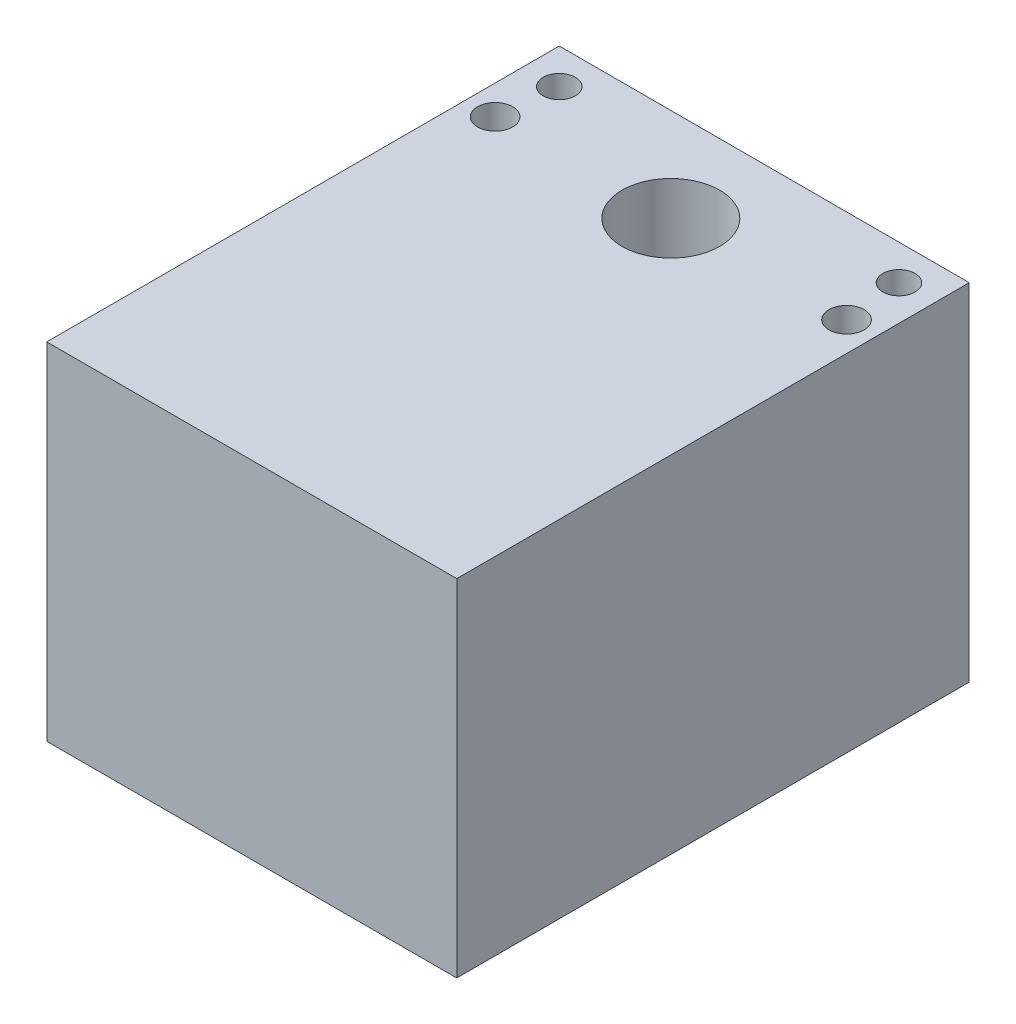
ISO-10303-21;
HEADER;
FILE_DESCRIPTION(('STEP AP214'),'2;1');
FILE_NAME('part.step','',(''),(''),'','','');
FILE_SCHEMA(('AUTOMOTIVE_DESIGN { 1 0 10303 214 1 1 1 1 }'));
ENDSEC;
DATA;
#1=APPLICATION_CONTEXT('core data for automotive mechanical design processes');
#2=APPLICATION_PROTOCOL_DEFINITION('international standard','automotive_design',2000,#1);
#3=PRODUCT_CONTEXT('',#1,'mechanical');
#4=PRODUCT('Part','Part','',(#3));
#5=PRODUCT_RELATED_PRODUCT_CATEGORY('part','',(#4));
#6=PRODUCT_DEFINITION_FORMATION('','',#4);
#7=PRODUCT_DEFINITION_CONTEXT('part definition',#1,'design');
#8=PRODUCT_DEFINITION('design','',#6,#7);
#9=PRODUCT_DEFINITION_SHAPE('','',#8);
#10=(LENGTH_UNIT() NAMED_UNIT(*) SI_UNIT(.MILLI.,.METRE.));
#11=(NAMED_UNIT(*) PLANE_ANGLE_UNIT() SI_UNIT($,.RADIAN.));
#12=(NAMED_UNIT(*) SI_UNIT($,.STERADIAN.) SOLID_ANGLE_UNIT());
#13=UNCERTAINTY_MEASURE_WITH_UNIT(LENGTH_MEASURE(1.E-05),#10,'distance_accuracy_value','');
#14=(GEOMETRIC_REPRESENTATION_CONTEXT(3) GLOBAL_UNCERTAINTY_ASSIGNED_CONTEXT((#13)) GLOBAL_UNIT_ASSIGNED_CONTEXT((#10,
#11,#12)) REPRESENTATION_CONTEXT('',''));
#15=CARTESIAN_POINT('',(0.,0.,0.));
#16=DIRECTION('',(0.,0.,1.));
#17=DIRECTION('',(1.,0.,0.));
#18=AXIS2_PLACEMENT_3D('',#15,#16,#17);
#19=CARTESIAN_POINT('',(0.,30.,0.));
#20=DIRECTION('',(0.,1.,0.));
#21=DIRECTION('',(0.,0.,1.));
#22=AXIS2_PLACEMENT_3D('',#19,#20,#21);
#23=PLANE('',#22);
#24=CARTESIAN_POINT('',(15.24,30.,-14.122));
#25=DIRECTION('',(0.,1.,0.));
#26=DIRECTION('',(0.,0.,1.));
#27=AXIS2_PLACEMENT_3D('',#24,#25,#26);
#28=CIRCLE('',#27,1.52400000000001);
#29=CARTESIAN_POINT('',(15.24,30.,-12.598));
#30=VERTEX_POINT('',#29);
#31=EDGE_CURVE('E129',#30,#30,#28,.T.);
#32=ORIENTED_EDGE('',*,*,#31,.F.);
#33=EDGE_LOOP('',(#32));
#34=FACE_BOUND('',#33,.T.);
#35=CARTESIAN_POINT('',(14.732,30.,-19.177));
#36=DIRECTION('',(0.,1.,0.));
#37=DIRECTION('',(0.,0.,1.));
#38=AXIS2_PLACEMENT_3D('',#35,#36,#37);
#39=CIRCLE('',#38,1.397);
#40=CARTESIAN_POINT('',(14.732,30.,-17.78));
#41=VERTEX_POINT('',#40);
#42=EDGE_CURVE('E117',#41,#41,#39,.T.);
#43=ORIENTED_EDGE('',*,*,#42,.F.);
#44=EDGE_LOOP('',(#43));
#45=FACE_BOUND('',#44,.T.);
#46=DIRECTION('',(0.,0.,-1.));
#47=VECTOR('',#46,1.);
#48=CARTESIAN_POINT('',(17.78,30.,-22.225));
#49=LINE('',#48,#47);
#50=CARTESIAN_POINT('',(17.78,30.,22.225));
#51=VERTEX_POINT('',#50);
#52=CARTESIAN_POINT('',(17.78,30.,-22.225));
#53=VERTEX_POINT('',#52);
#54=EDGE_CURVE('E87',#51,#53,#49,.T.);
#55=ORIENTED_EDGE('',*,*,#54,.T.);
#56=DIRECTION('',(-1.,0.,0.));
#57=VECTOR('',#56,1.);
#58=CARTESIAN_POINT('',(-17.78,30.,-22.225));
#59=LINE('',#58,#57);
#60=CARTESIAN_POINT('',(-17.78,30.,-22.225));
#61=VERTEX_POINT('',#60);
#62=EDGE_CURVE('E82',#53,#61,#59,.T.);
#63=ORIENTED_EDGE('',*,*,#62,.T.);
#64=DIRECTION('',(0.,0.,1.));
#65=VECTOR('',#64,1.);
#66=CARTESIAN_POINT('',(-17.78,30.,-22.225));
#67=LINE('',#66,#65);
#68=CARTESIAN_POINT('',(-17.78,30.,22.225));
#69=VERTEX_POINT('',#68);
#70=EDGE_CURVE('E85',#61,#69,#67,.T.);
#71=ORIENTED_EDGE('',*,*,#70,.T.);
#72=DIRECTION('',(1.,0.,0.));
#73=VECTOR('',#72,1.);
#74=CARTESIAN_POINT('',(-17.78,30.,22.225));
#75=LINE('',#74,#73);
#76=EDGE_CURVE('E52',#69,#51,#75,.T.);
#77=ORIENTED_EDGE('',*,*,#76,.T.);
#78=EDGE_LOOP('',(#55,#63,#71,#77));
#79=FACE_BOUND('',#78,.T.);
#80=CARTESIAN_POINT('',(-14.732,30.,-19.177));
#81=DIRECTION('',(0.,1.,0.));
#82=DIRECTION('',(0.,0.,1.));
#83=AXIS2_PLACEMENT_3D('',#80,#81,#82);
#84=CIRCLE('',#83,1.397);
#85=CARTESIAN_POINT('',(-14.732,30.,-17.78));
#86=VERTEX_POINT('',#85);
#87=EDGE_CURVE('E102',#86,#86,#84,.T.);
#88=ORIENTED_EDGE('',*,*,#87,.F.);
#89=EDGE_LOOP('',(#88));
#90=FACE_BOUND('',#89,.T.);
#91=CARTESIAN_POINT('',(-15.24,30.,-14.122));
#92=DIRECTION('',(0.,1.,0.));
#93=DIRECTION('',(0.,0.,1.));
#94=AXIS2_PLACEMENT_3D('',#91,#92,#93);
#95=CIRCLE('',#94,1.524);
#96=CARTESIAN_POINT('',(-15.24,30.,-12.598));
#97=VERTEX_POINT('',#96);
#98=EDGE_CURVE('E123',#97,#97,#95,.T.);
#99=ORIENTED_EDGE('',*,*,#98,.F.);
#100=EDGE_LOOP('',(#99));
#101=FACE_BOUND('',#100,.T.);
#102=CARTESIAN_POINT('',(0.,30.,-14.122));
#103=DIRECTION('',(0.,1.,0.));
#104=DIRECTION('',(0.,0.,1.));
#105=AXIS2_PLACEMENT_3D('',#102,#103,#104);
#106=CIRCLE('',#105,4.23333333333333);
#107=CARTESIAN_POINT('',(0.,30.,-9.88866666666666));
#108=VERTEX_POINT('',#107);
#109=EDGE_CURVE('E135',#108,#108,#106,.T.);
#110=ORIENTED_EDGE('',*,*,#109,.F.);
#111=EDGE_LOOP('',(#110));
#112=FACE_BOUND('',#111,.T.);
#113=ADVANCED_FACE('F35',(#34,#45,#79,#90,#101,#112),#23,.T.);
#114=CARTESIAN_POINT('',(0.,0.,0.));
#115=DIRECTION('',(0.,1.,0.));
#116=DIRECTION('',(0.,0.,1.));
#117=AXIS2_PLACEMENT_3D('',#114,#115,#116);
#118=PLANE('',#117);
#119=DIRECTION('',(0.,0.,-1.));
#120=VECTOR('',#119,1.);
#121=CARTESIAN_POINT('',(17.78,0.,-22.225));
#122=LINE('',#121,#120);
#123=CARTESIAN_POINT('',(17.78,0.,22.225));
#124=VERTEX_POINT('',#123);
#125=CARTESIAN_POINT('',(17.78,0.,-22.225));
#126=VERTEX_POINT('',#125);
#127=EDGE_CURVE('E99',#124,#126,#122,.T.);
#128=ORIENTED_EDGE('',*,*,#127,.F.);
#129=DIRECTION('',(1.,0.,0.));
#130=VECTOR('',#129,1.);
#131=CARTESIAN_POINT('',(-17.78,0.,22.225));
#132=LINE('',#131,#130);
#133=CARTESIAN_POINT('',(-17.78,0.,22.225));
#134=VERTEX_POINT('',#133);
#135=EDGE_CURVE('E75',#134,#124,#132,.T.);
#136=ORIENTED_EDGE('',*,*,#135,.F.);
#137=DIRECTION('',(0.,0.,1.));
#138=VECTOR('',#137,1.);
#139=CARTESIAN_POINT('',(-17.78,0.,-22.225));
#140=LINE('',#139,#138);
#141=CARTESIAN_POINT('',(-17.78,0.,-22.225));
#142=VERTEX_POINT('',#141);
#143=EDGE_CURVE('E69',#142,#134,#140,.T.);
#144=ORIENTED_EDGE('',*,*,#143,.F.);
#145=DIRECTION('',(-1.,0.,0.));
#146=VECTOR('',#145,1.);
#147=CARTESIAN_POINT('',(-17.78,0.,-22.225));
#148=LINE('',#147,#146);
#149=EDGE_CURVE('E91',#126,#142,#148,.T.);
#150=ORIENTED_EDGE('',*,*,#149,.F.);
#151=EDGE_LOOP('',(#128,#136,#144,#150));
#152=FACE_BOUND('',#151,.T.);
#153=CARTESIAN_POINT('',(-14.732,0.,-19.177));
#154=DIRECTION('',(0.,1.,0.));
#155=DIRECTION('',(0.,0.,1.));
#156=AXIS2_PLACEMENT_3D('',#153,#154,#155);
#157=CIRCLE('',#156,1.397);
#158=CARTESIAN_POINT('',(-14.732,0.,-17.78));
#159=VERTEX_POINT('',#158);
#160=EDGE_CURVE('E114',#159,#159,#157,.T.);
#161=ORIENTED_EDGE('',*,*,#160,.T.);
#162=EDGE_LOOP('',(#161));
#163=FACE_BOUND('',#162,.T.);
#164=CARTESIAN_POINT('',(14.732,0.,-19.177));
#165=DIRECTION('',(0.,1.,0.));
#166=DIRECTION('',(0.,0.,1.));
#167=AXIS2_PLACEMENT_3D('',#164,#165,#166);
#168=CIRCLE('',#167,1.397);
#169=CARTESIAN_POINT('',(14.732,0.,-17.78));
#170=VERTEX_POINT('',#169);
#171=EDGE_CURVE('E120',#170,#170,#168,.T.);
#172=ORIENTED_EDGE('',*,*,#171,.T.);
#173=EDGE_LOOP('',(#172));
#174=FACE_BOUND('',#173,.T.);
#175=CARTESIAN_POINT('',(-15.24,0.,-14.122));
#176=DIRECTION('',(0.,1.,0.));
#177=DIRECTION('',(0.,0.,1.));
#178=AXIS2_PLACEMENT_3D('',#175,#176,#177);
#179=CIRCLE('',#178,1.524);
#180=CARTESIAN_POINT('',(-15.24,0.,-12.598));
#181=VERTEX_POINT('',#180);
#182=EDGE_CURVE('E126',#181,#181,#179,.T.);
#183=ORIENTED_EDGE('',*,*,#182,.T.);
#184=EDGE_LOOP('',(#183));
#185=FACE_BOUND('',#184,.T.);
#186=CARTESIAN_POINT('',(15.24,0.,-14.122));
#187=DIRECTION('',(0.,1.,0.));
#188=DIRECTION('',(0.,0.,1.));
#189=AXIS2_PLACEMENT_3D('',#186,#187,#188);
#190=CIRCLE('',#189,1.52400000000001);
#191=CARTESIAN_POINT('',(15.24,0.,-12.598));
#192=VERTEX_POINT('',#191);
#193=EDGE_CURVE('E132',#192,#192,#190,.T.);
#194=ORIENTED_EDGE('',*,*,#193,.T.);
#195=EDGE_LOOP('',(#194));
#196=FACE_BOUND('',#195,.T.);
#197=CARTESIAN_POINT('',(0.,0.,-14.122));
#198=DIRECTION('',(0.,1.,0.));
#199=DIRECTION('',(0.,0.,1.));
#200=AXIS2_PLACEMENT_3D('',#197,#198,#199);
#201=CIRCLE('',#200,4.23333333333333);
#202=CARTESIAN_POINT('',(0.,0.,-9.88866666666666));
#203=VERTEX_POINT('',#202);
#204=EDGE_CURVE('E138',#203,#203,#201,.T.);
#205=ORIENTED_EDGE('',*,*,#204,.T.);
#206=EDGE_LOOP('',(#205));
#207=FACE_BOUND('',#206,.T.);
#208=ADVANCED_FACE('F110',(#152,#163,#174,#185,#196,#207),#118,.F.);
#209=CARTESIAN_POINT('',(17.78,30.,-22.225));
#210=DIRECTION('',(-1.,0.,0.));
#211=DIRECTION('',(0.,0.,1.));
#212=AXIS2_PLACEMENT_3D('',#209,#210,#211);
#213=PLANE('',#212);
#214=ORIENTED_EDGE('',*,*,#127,.T.);
#215=DIRECTION('',(0.,-1.,0.));
#216=VECTOR('',#215,1.);
#217=CARTESIAN_POINT('',(17.78,30.,-22.225));
#218=LINE('',#217,#216);
#219=EDGE_CURVE('E11',#53,#126,#218,.T.);
#220=ORIENTED_EDGE('',*,*,#219,.F.);
#221=ORIENTED_EDGE('',*,*,#54,.F.);
#222=DIRECTION('',(0.,-1.,0.));
#223=VECTOR('',#222,1.);
#224=CARTESIAN_POINT('',(17.78,30.,22.225));
#225=LINE('',#224,#223);
#226=EDGE_CURVE('E95',#51,#124,#225,.T.);
#227=ORIENTED_EDGE('',*,*,#226,.T.);
#228=EDGE_LOOP('',(#214,#220,#221,#227));
#229=FACE_BOUND('',#228,.T.);
#230=ADVANCED_FACE('F37',(#229),#213,.F.);
#231=CARTESIAN_POINT('',(-17.78,30.,-22.225));
#232=DIRECTION('',(0.,0.,1.));
#233=DIRECTION('',(1.,0.,0.));
#234=AXIS2_PLACEMENT_3D('',#231,#232,#233);
#235=PLANE('',#234);
#236=ORIENTED_EDGE('',*,*,#149,.T.);
#237=DIRECTION('',(0.,-1.,0.));
#238=VECTOR('',#237,1.);
#239=CARTESIAN_POINT('',(-17.78,30.,-22.225));
#240=LINE('',#239,#238);
#241=EDGE_CURVE('E44',#61,#142,#240,.T.);
#242=ORIENTED_EDGE('',*,*,#241,.F.);
#243=ORIENTED_EDGE('',*,*,#62,.F.);
#244=ORIENTED_EDGE('',*,*,#219,.T.);
#245=EDGE_LOOP('',(#236,#242,#243,#244));
#246=FACE_BOUND('',#245,.T.);
#247=ADVANCED_FACE('F90',(#246),#235,.F.);
#248=CARTESIAN_POINT('',(-17.78,30.,-22.225));
#249=DIRECTION('',(1.,0.,0.));
#250=DIRECTION('',(0.,0.,-1.));
#251=AXIS2_PLACEMENT_3D('',#248,#249,#250);
#252=PLANE('',#251);
#253=ORIENTED_EDGE('',*,*,#143,.T.);
#254=DIRECTION('',(0.,-1.,0.));
#255=VECTOR('',#254,1.);
#256=CARTESIAN_POINT('',(-17.78,30.,22.225));
#257=LINE('',#256,#255);
#258=EDGE_CURVE('E92',#69,#134,#257,.T.);
#259=ORIENTED_EDGE('',*,*,#258,.F.);
#260=ORIENTED_EDGE('',*,*,#70,.F.);
#261=ORIENTED_EDGE('',*,*,#241,.T.);
#262=EDGE_LOOP('',(#253,#259,#260,#261));
#263=FACE_BOUND('',#262,.T.);
#264=ADVANCED_FACE('F93',(#263),#252,.F.);
#265=CARTESIAN_POINT('',(-17.78,30.,22.225));
#266=DIRECTION('',(0.,0.,-1.));
#267=DIRECTION('',(-1.,0.,0.));
#268=AXIS2_PLACEMENT_3D('',#265,#266,#267);
#269=PLANE('',#268);
#270=ORIENTED_EDGE('',*,*,#135,.T.);
#271=ORIENTED_EDGE('',*,*,#226,.F.);
#272=ORIENTED_EDGE('',*,*,#76,.F.);
#273=ORIENTED_EDGE('',*,*,#258,.T.);
#274=EDGE_LOOP('',(#270,#271,#272,#273));
#275=FACE_BOUND('',#274,.T.);
#276=ADVANCED_FACE('F107',(#275),#269,.F.);
#277=CARTESIAN_POINT('',(-14.732,30.,-19.177));
#278=DIRECTION('',(0.,-1.,0.));
#279=DIRECTION('',(0.,0.,-1.));
#280=AXIS2_PLACEMENT_3D('',#277,#278,#279);
#281=CYLINDRICAL_SURFACE('',#280,1.397);
#282=ORIENTED_EDGE('',*,*,#87,.T.);
#283=EDGE_LOOP('',(#282));
#284=FACE_BOUND('',#283,.T.);
#285=ORIENTED_EDGE('',*,*,#160,.F.);
#286=EDGE_LOOP('',(#285));
#287=FACE_BOUND('',#286,.T.);
#288=ADVANCED_FACE('F157',(#284,#287),#281,.F.);
#289=CARTESIAN_POINT('',(14.732,30.,-19.177));
#290=DIRECTION('',(0.,-1.,0.));
#291=DIRECTION('',(0.,0.,-1.));
#292=AXIS2_PLACEMENT_3D('',#289,#290,#291);
#293=CYLINDRICAL_SURFACE('',#292,1.397);
#294=ORIENTED_EDGE('',*,*,#42,.T.);
#295=EDGE_LOOP('',(#294));
#296=FACE_BOUND('',#295,.T.);
#297=ORIENTED_EDGE('',*,*,#171,.F.);
#298=EDGE_LOOP('',(#297));
#299=FACE_BOUND('',#298,.T.);
#300=ADVANCED_FACE('F203',(#296,#299),#293,.F.);
#301=CARTESIAN_POINT('',(-15.24,30.,-14.122));
#302=DIRECTION('',(0.,-1.,0.));
#303=DIRECTION('',(0.,0.,-1.));
#304=AXIS2_PLACEMENT_3D('',#301,#302,#303);
#305=CYLINDRICAL_SURFACE('',#304,1.524);
#306=ORIENTED_EDGE('',*,*,#98,.T.);
#307=EDGE_LOOP('',(#306));
#308=FACE_BOUND('',#307,.T.);
#309=ORIENTED_EDGE('',*,*,#182,.F.);
#310=EDGE_LOOP('',(#309));
#311=FACE_BOUND('',#310,.T.);
#312=ADVANCED_FACE('F211',(#308,#311),#305,.F.);
#313=CARTESIAN_POINT('',(15.24,30.,-14.122));
#314=DIRECTION('',(0.,-1.,0.));
#315=DIRECTION('',(0.,0.,-1.));
#316=AXIS2_PLACEMENT_3D('',#313,#314,#315);
#317=CYLINDRICAL_SURFACE('',#316,1.52400000000001);
#318=ORIENTED_EDGE('',*,*,#31,.T.);
#319=EDGE_LOOP('',(#318));
#320=FACE_BOUND('',#319,.T.);
#321=ORIENTED_EDGE('',*,*,#193,.F.);
#322=EDGE_LOOP('',(#321));
#323=FACE_BOUND('',#322,.T.);
#324=ADVANCED_FACE('F219',(#320,#323),#317,.F.);
#325=CARTESIAN_POINT('',(0.,30.,-14.122));
#326=DIRECTION('',(0.,-1.,0.));
#327=DIRECTION('',(0.,0.,-1.));
#328=AXIS2_PLACEMENT_3D('',#325,#326,#327);
#329=CYLINDRICAL_SURFACE('',#328,4.23333333333333);
#330=ORIENTED_EDGE('',*,*,#109,.T.);
#331=EDGE_LOOP('',(#330));
#332=FACE_BOUND('',#331,.T.);
#333=ORIENTED_EDGE('',*,*,#204,.F.);
#334=EDGE_LOOP('',(#333));
#335=FACE_BOUND('',#334,.T.);
#336=ADVANCED_FACE('F144',(#332,#335),#329,.F.);
#337=CLOSED_SHELL('',(#113,#208,#230,#247,#264,#276,#288,#300,#312,#324,#336));
#338=MANIFOLD_SOLID_BREP('B2',#337);
#339=ADVANCED_BREP_SHAPE_REPRESENTATION('',(#18,#338),#14);
#340=SHAPE_DEFINITION_REPRESENTATION(#9,#339);
ENDSEC;
END-ISO-10303-21;
